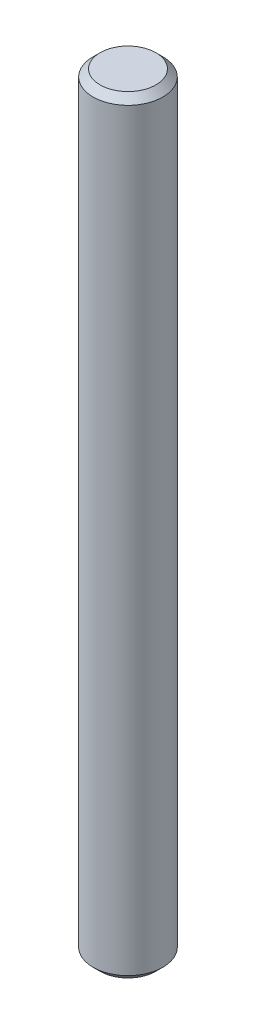
ISO-10303-21;
HEADER;
FILE_DESCRIPTION(('STEP AP214'),'2;1');
FILE_NAME('part.step','',(''),(''),'','','');
FILE_SCHEMA(('AUTOMOTIVE_DESIGN { 1 0 10303 214 1 1 1 1 }'));
ENDSEC;
DATA;
#1=APPLICATION_CONTEXT('core data for automotive mechanical design processes');
#2=APPLICATION_PROTOCOL_DEFINITION('international standard','automotive_design',2000,#1);
#3=PRODUCT_CONTEXT('',#1,'mechanical');
#4=PRODUCT('Part','Part','',(#3));
#5=PRODUCT_RELATED_PRODUCT_CATEGORY('part','',(#4));
#6=PRODUCT_DEFINITION_FORMATION('','',#4);
#7=PRODUCT_DEFINITION_CONTEXT('part definition',#1,'design');
#8=PRODUCT_DEFINITION('design','',#6,#7);
#9=PRODUCT_DEFINITION_SHAPE('','',#8);
#10=(LENGTH_UNIT() NAMED_UNIT(*) SI_UNIT(.MILLI.,.METRE.));
#11=(NAMED_UNIT(*) PLANE_ANGLE_UNIT() SI_UNIT($,.RADIAN.));
#12=(NAMED_UNIT(*) SI_UNIT($,.STERADIAN.) SOLID_ANGLE_UNIT());
#13=UNCERTAINTY_MEASURE_WITH_UNIT(LENGTH_MEASURE(1.E-05),#10,'distance_accuracy_value','');
#14=(GEOMETRIC_REPRESENTATION_CONTEXT(3) GLOBAL_UNCERTAINTY_ASSIGNED_CONTEXT((#13)) GLOBAL_UNIT_ASSIGNED_CONTEXT((#10,
#11,#12)) REPRESENTATION_CONTEXT('',''));
#15=CARTESIAN_POINT('',(0.,0.,0.));
#16=DIRECTION('',(0.,0.,1.));
#17=DIRECTION('',(1.,0.,0.));
#18=AXIS2_PLACEMENT_3D('',#15,#16,#17);
#19=CARTESIAN_POINT('',(0.,5.,0.));
#20=DIRECTION('',(0.,-1.,0.));
#21=DIRECTION('',(0.,0.,-1.));
#22=AXIS2_PLACEMENT_3D('',#19,#20,#21);
#23=CYLINDRICAL_SURFACE('',#22,0.5);
#24=CARTESIAN_POINT('',(0.,5.9,0.));
#25=DIRECTION('',(0.,1.,0.));
#26=DIRECTION('',(0.,0.,1.));
#27=AXIS2_PLACEMENT_3D('',#24,#25,#26);
#28=CIRCLE('',#27,0.5);
#29=CARTESIAN_POINT('',(0.,5.9,0.5));
#30=VERTEX_POINT('',#29);
#31=EDGE_CURVE('E10',#30,#30,#28,.F.);
#32=ORIENTED_EDGE('',*,*,#31,.T.);
#33=EDGE_LOOP('',(#32));
#34=FACE_BOUND('',#33,.T.);
#35=CARTESIAN_POINT('',(0.,-4.9,0.));
#36=DIRECTION('',(0.,1.,0.));
#37=DIRECTION('',(0.,0.,1.));
#38=AXIS2_PLACEMENT_3D('',#35,#36,#37);
#39=CIRCLE('',#38,0.5);
#40=CARTESIAN_POINT('',(0.,-4.9,0.5));
#41=VERTEX_POINT('',#40);
#42=EDGE_CURVE('E58',#41,#41,#39,.T.);
#43=ORIENTED_EDGE('',*,*,#42,.T.);
#44=EDGE_LOOP('',(#43));
#45=FACE_BOUND('',#44,.T.);
#46=ADVANCED_FACE('F43',(#34,#45),#23,.T.);
#47=CARTESIAN_POINT('',(0.,-5.,0.));
#48=DIRECTION('',(0.,1.,0.));
#49=DIRECTION('',(0.,0.,1.));
#50=AXIS2_PLACEMENT_3D('',#47,#48,#49);
#51=PLANE('',#50);
#52=CARTESIAN_POINT('',(0.,-5.,0.));
#53=DIRECTION('',(0.,1.,0.));
#54=DIRECTION('',(0.,0.,1.));
#55=AXIS2_PLACEMENT_3D('',#52,#53,#54);
#56=CIRCLE('',#55,0.400000000000001);
#57=CARTESIAN_POINT('',(0.,-5.,0.400000000000001));
#58=VERTEX_POINT('',#57);
#59=EDGE_CURVE('E54',#58,#58,#56,.F.);
#60=ORIENTED_EDGE('',*,*,#59,.T.);
#61=EDGE_LOOP('',(#60));
#62=FACE_BOUND('',#61,.T.);
#63=ADVANCED_FACE('F68',(#62),#51,.F.);
#64=CARTESIAN_POINT('',(0.,-4.9,0.));
#65=DIRECTION('',(0.,1.,0.));
#66=DIRECTION('',(0.,0.,1.));
#67=AXIS2_PLACEMENT_3D('',#64,#65,#66);
#68=CONICAL_SURFACE('',#67,0.5,0.785398163397438);
#69=ORIENTED_EDGE('',*,*,#59,.F.);
#70=EDGE_LOOP('',(#69));
#71=FACE_BOUND('',#70,.T.);
#72=ORIENTED_EDGE('',*,*,#42,.F.);
#73=EDGE_LOOP('',(#72));
#74=FACE_BOUND('',#73,.T.);
#75=ADVANCED_FACE('F65',(#71,#74),#68,.T.);
#76=CARTESIAN_POINT('',(0.,6.,0.));
#77=DIRECTION('',(0.,1.,0.));
#78=DIRECTION('',(0.,0.,1.));
#79=AXIS2_PLACEMENT_3D('',#76,#77,#78);
#80=PLANE('',#79);
#81=CARTESIAN_POINT('',(0.,6.,0.));
#82=DIRECTION('',(0.,1.,0.));
#83=DIRECTION('',(0.,0.,1.));
#84=AXIS2_PLACEMENT_3D('',#81,#82,#83);
#85=CIRCLE('',#84,0.399999999999999);
#86=CARTESIAN_POINT('',(0.,6.,0.399999999999999));
#87=VERTEX_POINT('',#86);
#88=EDGE_CURVE('E50',#87,#87,#85,.T.);
#89=ORIENTED_EDGE('',*,*,#88,.T.);
#90=EDGE_LOOP('',(#89));
#91=FACE_BOUND('',#90,.T.);
#92=ADVANCED_FACE('F67',(#91),#80,.T.);
#93=CARTESIAN_POINT('',(0.,6.,0.));
#94=DIRECTION('',(0.,-1.,0.));
#95=DIRECTION('',(0.,0.,-1.));
#96=AXIS2_PLACEMENT_3D('',#93,#94,#95);
#97=CONICAL_SURFACE('',#96,0.399999999999999,0.785398163397442);
#98=ORIENTED_EDGE('',*,*,#31,.F.);
#99=EDGE_LOOP('',(#98));
#100=FACE_BOUND('',#99,.T.);
#101=ORIENTED_EDGE('',*,*,#88,.F.);
#102=EDGE_LOOP('',(#101));
#103=FACE_BOUND('',#102,.T.);
#104=ADVANCED_FACE('F45',(#100,#103),#97,.T.);
#105=CLOSED_SHELL('',(#46,#63,#75,#92,#104));
#106=MANIFOLD_SOLID_BREP('B2',#105);
#107=ADVANCED_BREP_SHAPE_REPRESENTATION('',(#18,#106),#14);
#108=SHAPE_DEFINITION_REPRESENTATION(#9,#107);
ENDSEC;
END-ISO-10303-21;
